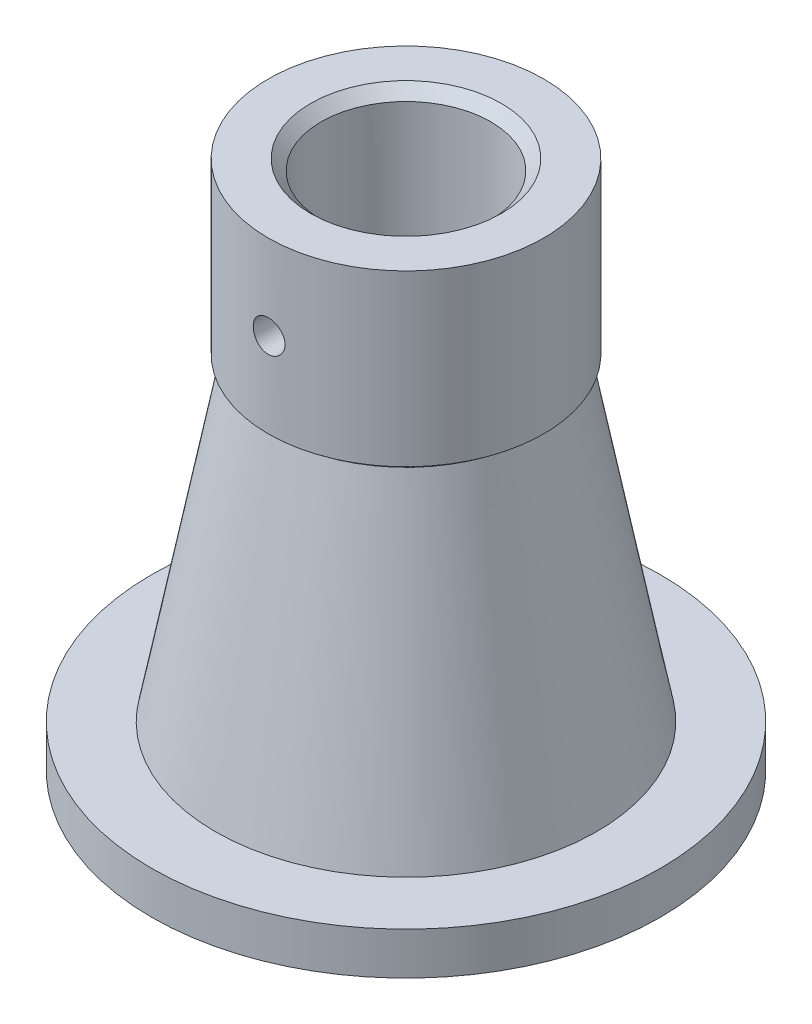
ISO-10303-21;
HEADER;
FILE_DESCRIPTION(('STEP AP214'),'2;1');
FILE_NAME('part.step','',(''),(''),'','','');
FILE_SCHEMA(('AUTOMOTIVE_DESIGN { 1 0 10303 214 1 1 1 1 }'));
ENDSEC;
DATA;
#1=APPLICATION_CONTEXT('core data for automotive mechanical design processes');
#2=APPLICATION_PROTOCOL_DEFINITION('international standard','automotive_design',2000,#1);
#3=PRODUCT_CONTEXT('',#1,'mechanical');
#4=PRODUCT('Part','Part','',(#3));
#5=PRODUCT_RELATED_PRODUCT_CATEGORY('part','',(#4));
#6=PRODUCT_DEFINITION_FORMATION('','',#4);
#7=PRODUCT_DEFINITION_CONTEXT('part definition',#1,'design');
#8=PRODUCT_DEFINITION('design','',#6,#7);
#9=PRODUCT_DEFINITION_SHAPE('','',#8);
#10=(LENGTH_UNIT() NAMED_UNIT(*) SI_UNIT(.MILLI.,.METRE.));
#11=(NAMED_UNIT(*) PLANE_ANGLE_UNIT() SI_UNIT($,.RADIAN.));
#12=(NAMED_UNIT(*) SI_UNIT($,.STERADIAN.) SOLID_ANGLE_UNIT());
#13=UNCERTAINTY_MEASURE_WITH_UNIT(LENGTH_MEASURE(1.E-05),#10,'distance_accuracy_value','');
#14=(GEOMETRIC_REPRESENTATION_CONTEXT(3) GLOBAL_UNCERTAINTY_ASSIGNED_CONTEXT((#13)) GLOBAL_UNIT_ASSIGNED_CONTEXT((#10,
#11,#12)) REPRESENTATION_CONTEXT('',''));
#15=CARTESIAN_POINT('',(0.,0.,0.));
#16=DIRECTION('',(0.,0.,1.));
#17=DIRECTION('',(1.,0.,0.));
#18=AXIS2_PLACEMENT_3D('',#15,#16,#17);
#19=CARTESIAN_POINT('',(0.,126.434782608696,0.));
#20=DIRECTION('',(0.,1.,0.));
#21=DIRECTION('',(0.,0.,1.));
#22=AXIS2_PLACEMENT_3D('',#19,#20,#21);
#23=CYLINDRICAL_SURFACE('',#22,65.);
#24=CARTESIAN_POINT('',(0.,250.,0.));
#25=DIRECTION('',(0.,1.,0.));
#26=DIRECTION('',(0.,0.,1.));
#27=AXIS2_PLACEMENT_3D('',#24,#25,#26);
#28=CIRCLE('',#27,65.);
#29=CARTESIAN_POINT('',(0.,250.,65.));
#30=VERTEX_POINT('',#29);
#31=EDGE_CURVE('E71',#30,#30,#28,.T.);
#32=ORIENTED_EDGE('',*,*,#31,.F.);
#33=EDGE_LOOP('',(#32));
#34=FACE_BOUND('',#33,.T.);
#35=CARTESIAN_POINT('',(0.,170.,0.));
#36=DIRECTION('',(0.,1.,0.));
#37=DIRECTION('',(0.,0.,1.));
#38=AXIS2_PLACEMENT_3D('',#35,#36,#37);
#39=CIRCLE('',#38,65.);
#40=CARTESIAN_POINT('',(0.,170.,65.));
#41=VERTEX_POINT('',#40);
#42=EDGE_CURVE('E68',#41,#41,#39,.T.);
#43=ORIENTED_EDGE('',*,*,#42,.T.);
#44=EDGE_LOOP('',(#43));
#45=FACE_BOUND('',#44,.T.);
#46=CARTESIAN_POINT('',(-7.5,210.,64.5658578507248));
#47=CARTESIAN_POINT('',(-7.50000226594626,210.209959431137,64.5658571285948));
#48=CARTESIAN_POINT('',(-7.49118018237764,210.419885077416,64.5668840736991));
#49=CARTESIAN_POINT('',(-7.45595870806996,210.83830369412,64.57096103377));
#50=CARTESIAN_POINT('',(-7.42955523721588,211.046796320633,64.574011518339));
#51=CARTESIAN_POINT('',(-7.35933288185559,211.460949327729,64.5820521728103));
#52=CARTESIAN_POINT('',(-7.31550064459549,211.666607411389,64.5870438298443));
#53=CARTESIAN_POINT('',(-7.21072565323716,212.073546268437,64.5988251711745));
#54=CARTESIAN_POINT('',(-7.14977663295992,212.274825409635,64.6056155138888));
#55=CARTESIAN_POINT('',(-7.01129140626987,212.671299541507,64.6207910445353));
#56=CARTESIAN_POINT('',(-6.93377222404295,212.866500542809,64.6291745946325));
#57=CARTESIAN_POINT('',(-6.76263842007811,213.249734857629,64.6473056153026));
#58=CARTESIAN_POINT('',(-6.66901787072008,213.437765500166,64.6570535879323));
#59=CARTESIAN_POINT('',(-6.46642735128844,213.805167526787,64.6776288404629));
#60=CARTESIAN_POINT('',(-6.35746596712727,213.984543679701,64.6884555156547));
#61=CARTESIAN_POINT('',(-6.12488191424142,214.333568568564,64.7108914354393));
#62=CARTESIAN_POINT('',(-6.0012538220948,214.503213671572,64.7225009688264));
#63=CARTESIAN_POINT('',(-5.73972518322123,214.832171305297,64.7462188526406));
#64=CARTESIAN_POINT('',(-5.60177077583474,214.991440889943,64.7583289742801));
#65=CARTESIAN_POINT('',(-5.31290677510915,215.297864915849,64.7826676791338));
#66=CARTESIAN_POINT('',(-5.16199241030994,215.445014855627,64.7948963044947));
#67=CARTESIAN_POINT('',(-4.84835771060162,215.726058971959,64.8191187193592));
#68=CARTESIAN_POINT('',(-4.68564116630815,215.859957372249,64.8311125827056));
#69=CARTESIAN_POINT('',(-4.34943291868532,216.113656797444,64.854535953591));
#70=CARTESIAN_POINT('',(-4.17593726237027,216.233452603373,64.8659652512976));
#71=CARTESIAN_POINT('',(-3.81896908737816,216.458335007624,64.887961366149));
#72=CARTESIAN_POINT('',(-3.63547155985923,216.563382143308,64.8985258389936));
#73=CARTESIAN_POINT('',(-3.26021039926499,216.757637724503,64.9184590679162));
#74=CARTESIAN_POINT('',(-3.06844666694015,216.846845979778,64.927827809632));
#75=CARTESIAN_POINT('',(-2.67802285119041,217.008769779811,64.9451027344747));
#76=CARTESIAN_POINT('',(-2.47936305318381,217.081486006216,64.9530089780469));
#77=CARTESIAN_POINT('',(-2.07655304900202,217.20989700838,64.9671342964657));
#78=CARTESIAN_POINT('',(-1.87240274081479,217.265591467642,64.9733533399409));
#79=CARTESIAN_POINT('',(-1.4610399768854,217.359324280402,64.9839017889052));
#80=CARTESIAN_POINT('',(-1.2538461967992,217.397443608012,64.9882398550205));
#81=CARTESIAN_POINT('',(-0.836886645027267,217.456136303733,64.9949468892524));
#82=CARTESIAN_POINT('',(-0.627120008799399,217.476703600448,64.9973151759985));
#83=CARTESIAN_POINT('',(-0.206654095367972,217.500105831763,65.0000110302902));
#84=CARTESIAN_POINT('',(0.00404478658155516,217.502947672689,65.0003393926465));
#85=CARTESIAN_POINT('',(0.424950434743227,217.490916510962,64.9989527716076));
#86=CARTESIAN_POINT('',(0.635156990952223,217.47603697871,64.9972370350458));
#87=CARTESIAN_POINT('',(1.26061069665183,217.405126957799,64.989100728915));
#88=CARTESIAN_POINT('',(1.67317576085794,217.322959965045,64.9797061511094));
#89=CARTESIAN_POINT('',(2.47839221774519,217.091077752687,64.9539864900117));
#90=CARTESIAN_POINT('',(2.87104327984752,216.941361412149,64.9376612917113));
#91=CARTESIAN_POINT('',(3.62662346899018,216.578266070038,64.8998538093771));
#92=CARTESIAN_POINT('',(3.98948179268722,216.364740705887,64.8783596914595));
#93=CARTESIAN_POINT('',(4.67432392854597,215.880195816165,64.8326208403166));
#94=CARTESIAN_POINT('',(4.99630614220927,215.60917404325,64.8083759995921));
#95=CARTESIAN_POINT('',(5.59224356797887,215.015449279366,64.7596857293851));
#96=CARTESIAN_POINT('',(5.86590810673468,214.692454449668,64.7352399541014));
#97=CARTESIAN_POINT('',(6.35518048167907,214.004958597565,64.6890429060712));
#98=CARTESIAN_POINT('',(6.57078818096266,213.640457477287,64.6672916396788));
#99=CARTESIAN_POINT('',(6.93783730294332,212.880051517233,64.6289458835084));
#100=CARTESIAN_POINT('',(7.0892576320424,212.484136404688,64.6123530894122));
#101=CARTESIAN_POINT('',(7.32338689804912,211.672265603129,64.5862369878234));
#102=CARTESIAN_POINT('',(7.40609864210297,211.256310733591,64.5767133915146));
#103=CARTESIAN_POINT('',(7.50008286660713,210.418729166884,64.5658657697814));
#104=CARTESIAN_POINT('',(7.51176345516959,209.99714884517,64.5644949040082));
#105=CARTESIAN_POINT('',(7.4644272626191,209.158036627992,64.5699842715286));
#106=CARTESIAN_POINT('',(7.40541176061295,208.740504659417,64.5768443558994));
#107=CARTESIAN_POINT('',(7.21870603944458,207.922553649004,64.5979797361151));
#108=CARTESIAN_POINT('',(7.09121151493723,207.522089335126,64.61223389772));
#109=CARTESIAN_POINT('',(6.7713502182312,206.748217637103,64.6465351758236));
#110=CARTESIAN_POINT('',(6.57898148868812,206.37481106974,64.6665824671064));
#111=CARTESIAN_POINT('',(6.13388619976384,205.66384484043,64.7103203989203));
#112=CARTESIAN_POINT('',(5.88089108951316,205.326454610301,64.7340270779501));
#113=CARTESIAN_POINT('',(5.32186320379247,204.698662120845,64.7823745719267));
#114=CARTESIAN_POINT('',(5.01582867526214,204.408261415231,64.8070154177285));
#115=CARTESIAN_POINT('',(4.52308261686259,204.013638088661,64.8426494591224));
#116=CARTESIAN_POINT('',(4.3526687846331,203.888620951888,64.8543385600909));
#117=CARTESIAN_POINT('',(4.00188656442386,203.653393457504,64.8769275439821));
#118=CARTESIAN_POINT('',(3.82152187671137,203.543177647619,64.8878277168316));
#119=CARTESIAN_POINT('',(3.45203340939253,203.338308963977,64.9085335325115));
#120=CARTESIAN_POINT('',(3.26290659205533,203.243661540138,64.9183387916689));
#121=CARTESIAN_POINT('',(2.87734634914979,203.070678306647,64.9365698326525));
#122=CARTESIAN_POINT('',(2.68091553095377,202.992336740803,64.944996101056));
#123=CARTESIAN_POINT('',(2.28251334417501,202.852650931519,64.960216935198));
#124=CARTESIAN_POINT('',(2.08055475589749,202.791270610048,64.9670149601798));
#125=CARTESIAN_POINT('',(1.67213794528984,202.685737360397,64.9788095109849));
#126=CARTESIAN_POINT('',(1.46567982673221,202.641584035356,64.9838060783087));
#127=CARTESIAN_POINT('',(1.04974241432843,202.570831613263,64.9918556855716));
#128=CARTESIAN_POINT('',(0.840263160490466,202.544232283967,64.9949087512241));
#129=CARTESIAN_POINT('',(0.419791929398565,202.508786041779,64.9989844175344));
#130=CARTESIAN_POINT('',(0.208799981765138,202.499938782227,65.0000070578422));
#131=CARTESIAN_POINT('',(-0.211988778038598,202.500061509824,64.9999929084272));
#132=CARTESIAN_POINT('',(-0.421785626658581,202.508931400734,64.9989676884602));
#133=CARTESIAN_POINT('',(-0.839805286531488,202.544216476721,64.9949105842206));
#134=CARTESIAN_POINT('',(-1.0480286218615,202.570625533827,64.9918794008087));
#135=CARTESIAN_POINT('',(-1.46153204439344,202.640794234658,64.9838956700565));
#136=CARTESIAN_POINT('',(-1.66681158964572,202.684557031761,64.9789427735218));
#137=CARTESIAN_POINT('',(-2.07293023890297,202.789110634996,64.9672550587187));
#138=CARTESIAN_POINT('',(-2.27376943817195,202.849901075431,64.9605202787193));
#139=CARTESIAN_POINT('',(-2.66954916037621,202.98805100643,64.9454595729931));
#140=CARTESIAN_POINT('',(-2.86449109569862,203.065406493253,64.9371340318026));
#141=CARTESIAN_POINT('',(-3.24716047558091,203.236136839251,64.9191238654313));
#142=CARTESIAN_POINT('',(-3.43488799693181,203.329511527857,64.9094392547217));
#143=CARTESIAN_POINT('',(-3.80185863966134,203.53163395132,64.888979449816));
#144=CARTESIAN_POINT('',(-3.98110018451837,203.640384527861,64.8782040541323));
#145=CARTESIAN_POINT('',(-4.32975687733135,203.87243585051,64.8558687829547));
#146=CARTESIAN_POINT('',(-4.49917554317567,203.995731339011,64.8443091915654));
#147=CARTESIAN_POINT('',(-4.82806491692668,204.256818429186,64.8206536412121));
#148=CARTESIAN_POINT('',(-4.98747036048,204.394692000691,64.8085548975614));
#149=CARTESIAN_POINT('',(-5.29405615316232,204.683302114178,64.7842312155165));
#150=CARTESIAN_POINT('',(-5.44124092526304,204.834033962026,64.7720063245951));
#151=CARTESIAN_POINT('',(-5.72250663632198,205.147446167402,64.7477633648549));
#152=CARTESIAN_POINT('',(-5.85657957691054,205.310133713381,64.7357454259164));
#153=CARTESIAN_POINT('',(-6.11052956720465,205.646177949516,64.7122684589393));
#154=CARTESIAN_POINT('',(-6.23041184069649,205.81953067773,64.7008092261523));
#155=CARTESIAN_POINT('',(-6.45560329565524,206.176406569266,64.678729419573));
#156=CARTESIAN_POINT('',(-6.5608571179017,206.359964873599,64.6681120936065));
#157=CARTESIAN_POINT('',(-6.75547125991437,206.735297728152,64.6480717293649));
#158=CARTESIAN_POINT('',(-6.84483740651906,206.927069234011,64.6386482536086));
#159=CARTESIAN_POINT('',(-7.00700889823298,207.31738092362,64.6212695629369));
#160=CARTESIAN_POINT('',(-7.0798274385089,207.515915568092,64.6133131791145));
#161=CARTESIAN_POINT('',(-7.20844196742309,207.918412807841,64.5990908593219));
#162=CARTESIAN_POINT('',(-7.26424204149813,208.122374087603,64.5928245176837));
#163=CARTESIAN_POINT('',(-7.37393737510261,208.602184370598,64.5804079373932));
#164=CARTESIAN_POINT('',(-7.42116351135466,208.879603292797,64.5749744552904));
#165=CARTESIAN_POINT('',(-7.48419321200805,209.438034989459,64.5676999060517));
#166=CARTESIAN_POINT('',(-7.49999696787749,209.719047742013,64.565858817026));
#167=CARTESIAN_POINT('',(-7.5,210.,64.5658578507248));
#168=B_SPLINE_CURVE_WITH_KNOTS('',3,(#46,#47,#48,#49,#50,#51,#52,#53,#54,#55,#56,#57,#58,#59,
#60,#61,#62,#63,#64,#65,#66,#67,#68,#69,#70,#71,#72,#73,#74,#75,#76,#77,#78,#79,#80,#81,#82,#83,
#84,#85,#86,#87,#88,#89,#90,#91,#92,#93,#94,#95,#96,#97,#98,#99,#100,#101,#102,#103,#104,#105,
#106,#107,#108,#109,#110,#111,#112,#113,#114,#115,#116,#117,#118,#119,#120,#121,#122,#123,#124,
#125,#126,#127,#128,#129,#130,#131,#132,#133,#134,#135,#136,#137,#138,#139,#140,#141,#142,#143,
#144,#145,#146,#147,#148,#149,#150,#151,#152,#153,#154,#155,#156,#157,#158,#159,#160,#161,#162,
#163,#164,#165,#166,#167),.UNSPECIFIED.,.T.,.F.,(4,2,2,2,2,2,2,2,2,2,2,2,2,2,2,2,2,2,2,2,2,2,2,
2,2,2,2,2,2,2,2,2,2,2,2,2,2,2,2,2,2,2,2,2,2,2,2,2,2,2,2,2,2,2,2,2,2,2,2,2,4),(0.,
0.629632474957954,1.25941111976144,1.88967319133563,2.52016629315989,3.15001471331666,
3.78009550662059,4.40982504975717,5.03978818294584,5.6722118870604,6.30486943675431,
6.93732468212007,7.57001325050474,8.2043636782209,8.83872172449032,9.47305354681715,
10.1073971629935,10.7387882137318,11.3703975795253,12.0017608374553,12.6333567988003,
13.8891806730126,15.1450253874844,16.4037731121755,17.6625700462173,18.9286992538077,
20.1948314470567,21.4613794015011,22.7278756075331,23.9870882564922,25.2462781228175,
26.5018885606234,27.7575368853207,29.0188535357457,30.2802118831969,30.9146209282664,
31.5487956352023,32.1831918730578,32.8173637791475,33.4501761771986,34.0829739961311,
34.7157634427466,35.3485405321799,35.9777527447438,36.6067452337587,37.2358520705038,
37.8649453971532,38.4938868443698,39.1228215952086,39.751872734462,40.3806971807908,
41.0132671351129,41.645607139156,42.2783305028812,42.9108202230095,43.545641873577,
44.1802302195007,44.8143107509671,45.4482389456379,46.2907719173177,47.1332997551188),.UNSPECIFIED.);
#169=CARTESIAN_POINT('',(-7.5,210.,64.5658578507248));
#170=VERTEX_POINT('',#169);
#171=EDGE_CURVE('E89',#170,#170,#168,.T.);
#172=ORIENTED_EDGE('',*,*,#171,.T.);
#173=EDGE_LOOP('',(#172));
#174=FACE_BOUND('',#173,.T.);
#175=ADVANCED_FACE('F41',(#34,#45,#174),#23,.T.);
#176=CARTESIAN_POINT('',(0.,126.434782608696,0.));
#177=DIRECTION('',(0.,1.,0.));
#178=DIRECTION('',(0.,0.,1.));
#179=AXIS2_PLACEMENT_3D('',#176,#177,#178);
#180=CYLINDRICAL_SURFACE('',#179,40.);
#181=CARTESIAN_POINT('',(0.,245.,0.));
#182=DIRECTION('',(0.,-1.,0.));
#183=DIRECTION('',(0.,0.,-1.));
#184=AXIS2_PLACEMENT_3D('',#181,#182,#183);
#185=CIRCLE('',#184,40.);
#186=CARTESIAN_POINT('',(0.,245.,-40.));
#187=VERTEX_POINT('',#186);
#188=EDGE_CURVE('E49',#187,#187,#185,.F.);
#189=ORIENTED_EDGE('',*,*,#188,.T.);
#190=EDGE_LOOP('',(#189));
#191=FACE_BOUND('',#190,.T.);
#192=CARTESIAN_POINT('',(0.,170.,0.));
#193=DIRECTION('',(0.,1.,0.));
#194=DIRECTION('',(0.,0.,1.));
#195=AXIS2_PLACEMENT_3D('',#192,#193,#194);
#196=CIRCLE('',#195,40.);
#197=CARTESIAN_POINT('',(0.,170.,40.));
#198=VERTEX_POINT('',#197);
#199=EDGE_CURVE('E74',#198,#198,#196,.T.);
#200=ORIENTED_EDGE('',*,*,#199,.F.);
#201=EDGE_LOOP('',(#200));
#202=FACE_BOUND('',#201,.T.);
#203=CARTESIAN_POINT('',(-7.5,210.,39.2905841137543));
#204=CARTESIAN_POINT('',(-7.50000378139181,209.791286269132,39.2905821782423));
#205=CARTESIAN_POINT('',(-7.4912852637607,209.582621238571,39.2922503106716));
#206=CARTESIAN_POINT('',(-7.45648665908722,209.166733114112,39.2988695092901));
#207=CARTESIAN_POINT('',(-7.43040343613883,208.959510287494,39.3038211684535));
#208=CARTESIAN_POINT('',(-7.36105475876168,208.547947938894,39.3168679945025));
#209=CARTESIAN_POINT('',(-7.31777959110729,208.343610114601,39.3249649383758));
#210=CARTESIAN_POINT('',(-7.2143669784398,207.939305532679,39.344067826025));
#211=CARTESIAN_POINT('',(-7.15422333261502,207.739340411639,39.35507483945));
#212=CARTESIAN_POINT('',(-7.0176295100155,207.345521027009,39.3796607416695));
#213=CARTESIAN_POINT('',(-6.94120088418369,207.151659072119,39.3932362288057));
#214=CARTESIAN_POINT('',(-6.77252626770316,206.771031686962,39.4225850738099));
#215=CARTESIAN_POINT('',(-6.68027444412908,206.584268904798,39.4383592417771));
#216=CARTESIAN_POINT('',(-6.4806852191813,206.21926385429,39.4716473529022));
#217=CARTESIAN_POINT('',(-6.37335482729174,206.041017678187,39.4891604865745));
#218=CARTESIAN_POINT('',(-6.14428714014437,205.694078233941,39.5254498052951));
#219=CARTESIAN_POINT('',(-6.0225444742278,205.525388561821,39.5442264600559));
#220=CARTESIAN_POINT('',(-5.76413060017075,205.19698805143,39.5827240216049));
#221=CARTESIAN_POINT('',(-5.62731249702876,205.037393723868,39.6024529303707));
#222=CARTESIAN_POINT('',(-5.34072941014398,204.730203981023,39.6421182194776));
#223=CARTESIAN_POINT('',(-5.19095964856907,204.58261303305,39.6620546739754));
#224=CARTESIAN_POINT('',(-4.87958110543589,204.300543488419,39.7015655119534));
#225=CARTESIAN_POINT('',(-4.71797589407355,204.166060965867,39.7211400024076));
#226=CARTESIAN_POINT('',(-4.38391872431102,203.911040294238,39.7593954409139));
#227=CARTESIAN_POINT('',(-4.21146279016506,203.790507302793,39.7780760569815));
#228=CARTESIAN_POINT('',(-3.85560513447759,203.563449144384,39.8141497993357));
#229=CARTESIAN_POINT('',(-3.67213138417968,203.457035128207,39.8315322868355));
#230=CARTESIAN_POINT('',(-3.29669257582263,203.260062605552,39.8643615384852));
#231=CARTESIAN_POINT('',(-3.10472746475573,203.169504198071,39.8798082905488));
#232=CARTESIAN_POINT('',(-2.71367566395661,203.00493306356,39.9083248187877));
#233=CARTESIAN_POINT('',(-2.51458950969417,202.930919095485,39.9213947732395));
#234=CARTESIAN_POINT('',(-2.11070662350943,202.800001197674,39.9447847753044));
#235=CARTESIAN_POINT('',(-1.90590983172604,202.743097447368,39.9551047940796));
#236=CARTESIAN_POINT('',(-1.49454411273695,202.647422092814,39.9725932777363));
#237=CARTESIAN_POINT('',(-1.28802464769302,202.608444363427,39.979797509426));
#238=CARTESIAN_POINT('',(-0.872289056726031,202.54793597328,39.9910287005747));
#239=CARTESIAN_POINT('',(-0.663072025003319,202.52641133662,39.9950545629767));
#240=CARTESIAN_POINT('',(-0.243609078902742,202.501016091992,39.9998073309128));
#241=CARTESIAN_POINT('',(-0.0333636550058057,202.49713776015,40.0005356797839));
#242=CARTESIAN_POINT('',(0.386718399783567,202.507024801342,39.9986839447152));
#243=CARTESIAN_POINT('',(0.596554852062274,202.520796658565,39.9961026449024));
#244=CARTESIAN_POINT('',(1.2177418918676,202.587938593236,39.9835750222809));
#245=CARTESIAN_POINT('',(1.6265518285251,202.666796776794,39.9689068258721));
#246=CARTESIAN_POINT('',(2.42480280475052,202.890678317335,39.9284431032317));
#247=CARTESIAN_POINT('',(2.81424313786217,203.035704085649,39.9026471714762));
#248=CARTESIAN_POINT('',(3.56553223355264,203.388638636265,39.8425625321822));
#249=CARTESIAN_POINT('',(3.92721300800367,203.596897434396,39.8082267501191));
#250=CARTESIAN_POINT('',(4.61080473775569,204.070128350553,39.7348575065778));
#251=CARTESIAN_POINT('',(4.9327116433842,204.335106236077,39.695823567543));
#252=CARTESIAN_POINT('',(5.53282676594448,204.919078513253,39.616675648507));
#253=CARTESIAN_POINT('',(5.8102891831137,205.238838918129,39.5765542853419));
#254=CARTESIAN_POINT('',(6.30775894730658,205.920747657774,39.5003254559703));
#255=CARTESIAN_POINT('',(6.52776545360409,206.282896612684,39.4642180485027));
#256=CARTESIAN_POINT('',(6.90429252102835,207.040291349651,39.4000946619147));
#257=CARTESIAN_POINT('',(7.06070467712629,207.435592271866,39.3720925225091));
#258=CARTESIAN_POINT('',(7.3046828538454,208.247505934576,39.3275621212645));
#259=CARTESIAN_POINT('',(7.39225667535265,208.664116254551,39.3110325593569));
#260=CARTESIAN_POINT('',(7.49498370113956,209.500096592843,39.2915760077362));
#261=CARTESIAN_POINT('',(7.51120849177301,209.919330387168,39.2884477631585));
#262=CARTESIAN_POINT('',(7.47364816661808,210.754517466114,39.2956095953729));
#263=CARTESIAN_POINT('',(7.41986651312593,211.170470911946,39.3058990085703));
#264=CARTESIAN_POINT('',(7.24474444239079,211.983763809933,39.3385489073185));
#265=CARTESIAN_POINT('',(7.12396576962123,212.381228640981,39.3608089766912));
#266=CARTESIAN_POINT('',(6.81885737824816,213.150288570988,39.41480706571));
#267=CARTESIAN_POINT('',(6.63452297580309,213.521881760869,39.4465457838772));
#268=CARTESIAN_POINT('',(6.20513215203982,214.233328197982,39.5163775420528));
#269=CARTESIAN_POINT('',(5.95939937098357,214.572765555133,39.5545397017362));
#270=CARTESIAN_POINT('',(5.41486282331753,215.20609733861,39.6327456383905));
#271=CARTESIAN_POINT('',(5.11605428495425,215.499987665597,39.6727895843043));
#272=CARTESIAN_POINT('',(4.63237490666709,215.902209987603,39.731198128913));
#273=CARTESIAN_POINT('',(4.46391676852157,216.030616206605,39.7505220568914));
#274=CARTESIAN_POINT('',(4.11667793128303,216.272773352836,39.7879805355081));
#275=CARTESIAN_POINT('',(3.93790106160693,216.386529666836,39.8061155221091));
#276=CARTESIAN_POINT('',(3.57118519237155,216.598601200879,39.8406899611805));
#277=CARTESIAN_POINT('',(3.38324297113837,216.696910939344,39.8571288110299));
#278=CARTESIAN_POINT('',(2.99963235696015,216.877288947177,39.8878328013561));
#279=CARTESIAN_POINT('',(2.8039669984815,216.959363520722,39.9020987850681));
#280=CARTESIAN_POINT('',(2.40720652617258,217.106327772187,39.92799373314));
#281=CARTESIAN_POINT('',(2.2061425794194,217.171299380649,39.9396352298959));
#282=CARTESIAN_POINT('',(1.79918606759492,217.284057496181,39.9600352477651));
#283=CARTESIAN_POINT('',(1.59329528965753,217.331850259928,39.9687948184013));
#284=CARTESIAN_POINT('',(1.17808873213313,217.409907796843,39.9831872121796));
#285=CARTESIAN_POINT('',(0.968772632992591,217.440170924948,39.9888197418634));
#286=CARTESIAN_POINT('',(0.548271530829174,217.482917797064,39.9967950710835));
#287=CARTESIAN_POINT('',(0.337086551863108,217.4954017696,39.9991379129038));
#288=CARTESIAN_POINT('',(-0.0823511912924124,217.502435419346,40.0004565878703));
#289=CARTESIAN_POINT('',(-0.290599284952848,217.497257051023,39.9994834783281));
#290=CARTESIAN_POINT('',(-0.705904590163133,217.469605680588,39.9943099060772));
#291=CARTESIAN_POINT('',(-0.912961798995311,217.447132639024,39.9901094360064));
#292=CARTESIAN_POINT('',(-1.32440357692152,217.385068686968,39.9785981700427));
#293=CARTESIAN_POINT('',(-1.5287881713331,217.345477938753,39.9712874036356));
#294=CARTESIAN_POINT('',(-1.93343805867145,217.249486587832,39.9537586678697));
#295=CARTESIAN_POINT('',(-2.13370343081329,217.193086308708,39.9435407544733));
#296=CARTESIAN_POINT('',(-2.52837181851814,217.064019095337,39.9205003057972));
#297=CARTESIAN_POINT('',(-2.72278458256085,216.991381128232,39.9076824124639));
#298=CARTESIAN_POINT('',(-3.104785143293,216.830320326014,39.8797817099885));
#299=CARTESIAN_POINT('',(-3.29237300039782,216.741897630673,39.8646989209016));
#300=CARTESIAN_POINT('',(-3.65950453401676,216.549881736635,39.8326749304679));
#301=CARTESIAN_POINT('',(-3.83904634317515,216.446285039871,39.8157333008285));
#302=CARTESIAN_POINT('',(-4.18878483852187,216.224702550783,39.7804596139016));
#303=CARTESIAN_POINT('',(-4.35898473794026,216.106721751544,39.7621280399297));
#304=CARTESIAN_POINT('',(-4.69141249931766,215.855314824704,39.7242878807953));
#305=CARTESIAN_POINT('',(-4.85348658326382,215.721687320153,39.7047659641588));
#306=CARTESIAN_POINT('',(-5.16577910301293,215.441390889401,39.6653437441451));
#307=CARTESIAN_POINT('',(-5.3160017109989,215.29472659168,39.6454435770161));
#308=CARTESIAN_POINT('',(-5.60372463353727,214.989220927412,39.6057997985858));
#309=CARTESIAN_POINT('',(-5.7412172841154,214.830372329265,39.5860562880538));
#310=CARTESIAN_POINT('',(-6.00238689669665,214.501710013382,39.5472979997883));
#311=CARTESIAN_POINT('',(-6.12606892344017,214.331900351664,39.5282829565972));
#312=CARTESIAN_POINT('',(-6.35993648403799,213.980720957272,39.4913327750977));
#313=CARTESIAN_POINT('',(-6.46998022034741,213.799255462777,39.4734098321351));
#314=CARTESIAN_POINT('',(-6.67432185500942,213.427591910444,39.439373181483));
#315=CARTESIAN_POINT('',(-6.76862555208389,213.237397101607,39.4232588082258));
#316=CARTESIAN_POINT('',(-6.94077547166137,212.849664882767,39.3933151058882));
#317=CARTESIAN_POINT('',(-7.01863229827434,212.652132301001,39.3794843057397));
#318=CARTESIAN_POINT('',(-7.15734754089694,212.25109067903,39.3545083252065));
#319=CARTESIAN_POINT('',(-7.21820939148168,212.047582855584,39.3433626022478));
#320=CARTESIAN_POINT('',(-7.34643414881668,211.541374947508,39.3196644715891));
#321=CARTESIAN_POINT('',(-7.40394662261242,211.236042119773,39.3088167295277));
#322=CARTESIAN_POINT('',(-7.480726217955,210.620436921241,39.2942780861766));
#323=CARTESIAN_POINT('',(-7.49999438056042,210.310164685132,39.2905869900741));
#324=CARTESIAN_POINT('',(-7.5,210.,39.2905841137543));
#325=B_SPLINE_CURVE_WITH_KNOTS('',3,(#203,#204,#205,#206,#207,#208,#209,#210,#211,#212,#213,
#214,#215,#216,#217,#218,#219,#220,#221,#222,#223,#224,#225,#226,#227,#228,#229,#230,#231,#232,
#233,#234,#235,#236,#237,#238,#239,#240,#241,#242,#243,#244,#245,#246,#247,#248,#249,#250,#251,
#252,#253,#254,#255,#256,#257,#258,#259,#260,#261,#262,#263,#264,#265,#266,#267,#268,#269,#270,
#271,#272,#273,#274,#275,#276,#277,#278,#279,#280,#281,#282,#283,#284,#285,#286,#287,#288,#289,
#290,#291,#292,#293,#294,#295,#296,#297,#298,#299,#300,#301,#302,#303,#304,#305,#306,#307,#308,
#309,#310,#311,#312,#313,#314,#315,#316,#317,#318,#319,#320,#321,#322,#323,#324),.UNSPECIFIED.,
.T.,.F.,(4,2,2,2,2,2,2,2,2,2,2,2,2,2,2,2,2,2,2,2,2,2,2,2,2,2,2,2,2,2,2,2,2,2,2,2,2,2,2,2,2,2,2,
2,2,2,2,2,2,2,2,2,2,2,2,2,2,2,2,2,4),(0.,0.62586880717436,1.25185067116832,1.87818671092285,
2.50475329273271,3.13049579286754,3.75646945895565,4.38215308939457,5.00807061588569,
5.64074127406577,6.27364632657366,6.90636124171899,7.53930935148544,8.17697703413137,
8.8146486980127,9.45227251229927,10.0899030129159,10.7200060898936,11.3503265604828,
11.9803711102001,12.6106471871328,13.8540467070367,15.0974915435217,16.3479487763114,
17.5985332226897,18.8682949153037,20.1380751867204,21.4100109830293,22.6818026204579,
23.9344266065136,25.1869886441216,26.4292037929541,27.6715105084016,28.9281573098929,
30.1849171469196,30.8223805643474,31.4596089131007,32.0970628888953,32.7342688508838,
33.3683643607034,34.0022286931156,34.6361525007024,35.2700681600581,35.8942674972971,
36.5184682584326,37.1426631022526,37.7668459311927,38.3899240146695,39.0129965811965,
39.6362130115947,40.2592137204643,40.8913634428876,41.5232896215312,42.1555938057875,
42.7876653395963,43.4258379080446,44.0637748485792,44.7012992157315,45.3386946499195,
46.2688092388243,47.1988985084848),.UNSPECIFIED.);
#326=CARTESIAN_POINT('',(-7.5,210.,39.2905841137543));
#327=VERTEX_POINT('',#326);
#328=EDGE_CURVE('E97',#327,#327,#325,.T.);
#329=ORIENTED_EDGE('',*,*,#328,.T.);
#330=EDGE_LOOP('',(#329));
#331=FACE_BOUND('',#330,.T.);
#332=ADVANCED_FACE('F127',(#191,#202,#331),#180,.F.);
#333=CARTESIAN_POINT('',(0.,126.434782608696,0.));
#334=DIRECTION('',(0.,1.,0.));
#335=DIRECTION('',(0.,0.,1.));
#336=AXIS2_PLACEMENT_3D('',#333,#334,#335);
#337=CYLINDRICAL_SURFACE('',#336,120.);
#338=CARTESIAN_POINT('',(0.,20.,0.));
#339=DIRECTION('',(0.,1.,0.));
#340=DIRECTION('',(0.,0.,1.));
#341=AXIS2_PLACEMENT_3D('',#338,#339,#340);
#342=CIRCLE('',#341,120.);
#343=CARTESIAN_POINT('',(0.,20.,120.));
#344=VERTEX_POINT('',#343);
#345=EDGE_CURVE('E53',#344,#344,#342,.T.);
#346=ORIENTED_EDGE('',*,*,#345,.F.);
#347=EDGE_LOOP('',(#346));
#348=FACE_BOUND('',#347,.T.);
#349=CARTESIAN_POINT('',(0.,0.,0.));
#350=DIRECTION('',(0.,1.,0.));
#351=DIRECTION('',(0.,0.,1.));
#352=AXIS2_PLACEMENT_3D('',#349,#350,#351);
#353=CIRCLE('',#352,120.);
#354=CARTESIAN_POINT('',(0.,0.,120.));
#355=VERTEX_POINT('',#354);
#356=EDGE_CURVE('E86',#355,#355,#353,.T.);
#357=ORIENTED_EDGE('',*,*,#356,.T.);
#358=EDGE_LOOP('',(#357));
#359=FACE_BOUND('',#358,.T.);
#360=ADVANCED_FACE('F130',(#348,#359),#337,.T.);
#361=CARTESIAN_POINT('',(120.,20.,0.));
#362=DIRECTION('',(0.,-1.,0.));
#363=DIRECTION('',(0.,0.,-1.));
#364=AXIS2_PLACEMENT_3D('',#361,#362,#363);
#365=PLANE('',#364);
#366=CARTESIAN_POINT('',(0.,20.,0.));
#367=DIRECTION('',(0.,1.,0.));
#368=DIRECTION('',(0.,0.,1.));
#369=AXIS2_PLACEMENT_3D('',#366,#367,#368);
#370=CIRCLE('',#369,90.);
#371=CARTESIAN_POINT('',(0.,20.,90.));
#372=VERTEX_POINT('',#371);
#373=EDGE_CURVE('E57',#372,#372,#370,.T.);
#374=ORIENTED_EDGE('',*,*,#373,.F.);
#375=EDGE_LOOP('',(#374));
#376=FACE_BOUND('',#375,.T.);
#377=ORIENTED_EDGE('',*,*,#345,.T.);
#378=EDGE_LOOP('',(#377));
#379=FACE_BOUND('',#378,.T.);
#380=ADVANCED_FACE('F147',(#376,#379),#365,.F.);
#381=CARTESIAN_POINT('',(0.,20.,0.));
#382=DIRECTION('',(0.,-1.,0.));
#383=DIRECTION('',(0.,0.,-1.));
#384=AXIS2_PLACEMENT_3D('',#381,#382,#383);
#385=CONICAL_SURFACE('',#384,90.,0.188462427370045);
#386=CARTESIAN_POINT('',(0.,167.541531883971,0.));
#387=DIRECTION('',(0.,1.,0.));
#388=DIRECTION('',(0.,0.,1.));
#389=AXIS2_PLACEMENT_3D('',#386,#387,#388);
#390=CIRCLE('',#389,61.8600137167915);
#391=CARTESIAN_POINT('',(0.,167.541531883971,61.8600137167915));
#392=VERTEX_POINT('',#391);
#393=EDGE_CURVE('E62',#392,#392,#390,.T.);
#394=ORIENTED_EDGE('',*,*,#393,.F.);
#395=EDGE_LOOP('',(#394));
#396=FACE_BOUND('',#395,.T.);
#397=ORIENTED_EDGE('',*,*,#373,.T.);
#398=EDGE_LOOP('',(#397));
#399=FACE_BOUND('',#398,.T.);
#400=ADVANCED_FACE('F143',(#396,#399),#385,.T.);
#401=CARTESIAN_POINT('',(0.,165.773023922902,0.));
#402=DIRECTION('',(0.,1.,0.));
#403=DIRECTION('',(0.,0.,1.));
#404=AXIS2_PLACEMENT_3D('',#401,#402,#403);
#405=TOROIDAL_SURFACE('',#404,66.5368053084315,5.);
#406=CARTESIAN_POINT('',(0.,170.,0.));
#407=DIRECTION('',(0.,1.,0.));
#408=DIRECTION('',(0.,0.,1.));
#409=AXIS2_PLACEMENT_3D('',#406,#407,#408);
#410=CIRCLE('',#409,63.8660988019729);
#411=CARTESIAN_POINT('',(0.,170.,63.8660988019729));
#412=VERTEX_POINT('',#411);
#413=EDGE_CURVE('E65',#412,#412,#410,.T.);
#414=ORIENTED_EDGE('',*,*,#413,.F.);
#415=EDGE_LOOP('',(#414));
#416=FACE_BOUND('',#415,.T.);
#417=ORIENTED_EDGE('',*,*,#393,.T.);
#418=EDGE_LOOP('',(#417));
#419=FACE_BOUND('',#418,.T.);
#420=ADVANCED_FACE('F139',(#416,#419),#405,.F.);
#421=CARTESIAN_POINT('',(63.8660988019729,170.,0.));
#422=DIRECTION('',(0.,1.,0.));
#423=DIRECTION('',(0.,0.,1.));
#424=AXIS2_PLACEMENT_3D('',#421,#422,#423);
#425=PLANE('',#424);
#426=ORIENTED_EDGE('',*,*,#42,.F.);
#427=EDGE_LOOP('',(#426));
#428=FACE_BOUND('',#427,.T.);
#429=ORIENTED_EDGE('',*,*,#413,.T.);
#430=EDGE_LOOP('',(#429));
#431=FACE_BOUND('',#430,.T.);
#432=ADVANCED_FACE('F133',(#428,#431),#425,.F.);
#433=CARTESIAN_POINT('',(65.,250.,0.));
#434=DIRECTION('',(0.,-1.,0.));
#435=DIRECTION('',(0.,0.,-1.));
#436=AXIS2_PLACEMENT_3D('',#433,#434,#435);
#437=PLANE('',#436);
#438=CARTESIAN_POINT('',(0.,250.,0.));
#439=DIRECTION('',(0.,-1.,0.));
#440=DIRECTION('',(0.,0.,-1.));
#441=AXIS2_PLACEMENT_3D('',#438,#439,#440);
#442=CIRCLE('',#441,44.9999999999999);
#443=CARTESIAN_POINT('',(0.,250.,-44.9999999999999));
#444=VERTEX_POINT('',#443);
#445=EDGE_CURVE('E10',#444,#444,#442,.T.);
#446=ORIENTED_EDGE('',*,*,#445,.T.);
#447=EDGE_LOOP('',(#446));
#448=FACE_BOUND('',#447,.T.);
#449=ORIENTED_EDGE('',*,*,#31,.T.);
#450=EDGE_LOOP('',(#449));
#451=FACE_BOUND('',#450,.T.);
#452=ADVANCED_FACE('F125',(#448,#451),#437,.F.);
#453=CARTESIAN_POINT('',(40.,170.,0.));
#454=DIRECTION('',(0.,1.,0.));
#455=DIRECTION('',(0.,0.,1.));
#456=AXIS2_PLACEMENT_3D('',#453,#454,#455);
#457=PLANE('',#456);
#458=CARTESIAN_POINT('',(0.,170.,0.));
#459=DIRECTION('',(0.,1.,0.));
#460=DIRECTION('',(0.,0.,1.));
#461=AXIS2_PLACEMENT_3D('',#458,#459,#460);
#462=CIRCLE('',#461,45.);
#463=CARTESIAN_POINT('',(0.,170.,45.));
#464=VERTEX_POINT('',#463);
#465=EDGE_CURVE('E77',#464,#464,#462,.T.);
#466=ORIENTED_EDGE('',*,*,#465,.F.);
#467=EDGE_LOOP('',(#466));
#468=FACE_BOUND('',#467,.T.);
#469=ORIENTED_EDGE('',*,*,#199,.T.);
#470=EDGE_LOOP('',(#469));
#471=FACE_BOUND('',#470,.T.);
#472=ADVANCED_FACE('F121',(#468,#471),#457,.F.);
#473=CARTESIAN_POINT('',(0.,165.23183436932,0.));
#474=DIRECTION('',(0.,1.,0.));
#475=DIRECTION('',(0.,0.,1.));
#476=AXIS2_PLACEMENT_3D('',#473,#474,#475);
#477=TOROIDAL_SURFACE('',#476,43.4951423594243,5.00000000000001);
#478=CARTESIAN_POINT('',(0.,167.115499272997,0.));
#479=DIRECTION('',(0.,1.,0.));
#480=DIRECTION('',(0.,0.,1.));
#481=AXIS2_PLACEMENT_3D('',#478,#479,#480);
#482=CIRCLE('',#481,48.1267518562036);
#483=CARTESIAN_POINT('',(0.,167.115499272997,48.1267518562036));
#484=VERTEX_POINT('',#483);
#485=EDGE_CURVE('E80',#484,#484,#482,.T.);
#486=ORIENTED_EDGE('',*,*,#485,.F.);
#487=EDGE_LOOP('',(#486));
#488=FACE_BOUND('',#487,.T.);
#489=ORIENTED_EDGE('',*,*,#465,.T.);
#490=EDGE_LOOP('',(#489));
#491=FACE_BOUND('',#490,.T.);
#492=ADVANCED_FACE('F117',(#488,#491),#477,.F.);
#493=CARTESIAN_POINT('',(0.,167.115499272997,0.));
#494=DIRECTION('',(0.,-1.,0.));
#495=DIRECTION('',(0.,0.,-1.));
#496=AXIS2_PLACEMENT_3D('',#493,#494,#495);
#497=CONICAL_SURFACE('',#496,48.1267518562036,0.188462427370045);
#498=CARTESIAN_POINT('',(0.,0.,0.));
#499=DIRECTION('',(0.,1.,0.));
#500=DIRECTION('',(0.,0.,1.));
#501=AXIS2_PLACEMENT_3D('',#498,#499,#500);
#502=CIRCLE('',#501,80.);
#503=CARTESIAN_POINT('',(0.,0.,80.));
#504=VERTEX_POINT('',#503);
#505=EDGE_CURVE('E83',#504,#504,#502,.T.);
#506=ORIENTED_EDGE('',*,*,#505,.F.);
#507=EDGE_LOOP('',(#506));
#508=FACE_BOUND('',#507,.T.);
#509=ORIENTED_EDGE('',*,*,#485,.T.);
#510=EDGE_LOOP('',(#509));
#511=FACE_BOUND('',#510,.T.);
#512=ADVANCED_FACE('F113',(#508,#511),#497,.F.);
#513=CARTESIAN_POINT('',(80.,0.,0.));
#514=DIRECTION('',(0.,1.,0.));
#515=DIRECTION('',(0.,0.,1.));
#516=AXIS2_PLACEMENT_3D('',#513,#514,#515);
#517=PLANE('',#516);
#518=ORIENTED_EDGE('',*,*,#356,.F.);
#519=EDGE_LOOP('',(#518));
#520=FACE_BOUND('',#519,.T.);
#521=ORIENTED_EDGE('',*,*,#505,.T.);
#522=EDGE_LOOP('',(#521));
#523=FACE_BOUND('',#522,.T.);
#524=ADVANCED_FACE('F109',(#520,#523),#517,.F.);
#525=CARTESIAN_POINT('',(0.,245.,0.));
#526=DIRECTION('',(0.,1.,0.));
#527=DIRECTION('',(0.,0.,1.));
#528=AXIS2_PLACEMENT_3D('',#525,#526,#527);
#529=CONICAL_SURFACE('',#528,40.,0.785398163397453);
#530=ORIENTED_EDGE('',*,*,#445,.F.);
#531=EDGE_LOOP('',(#530));
#532=FACE_BOUND('',#531,.T.);
#533=ORIENTED_EDGE('',*,*,#188,.F.);
#534=EDGE_LOOP('',(#533));
#535=FACE_BOUND('',#534,.T.);
#536=ADVANCED_FACE('F44',(#532,#535),#529,.F.);
#537=CARTESIAN_POINT('',(0.,210.,120.001));
#538=DIRECTION('',(0.,0.,-1.));
#539=DIRECTION('',(-1.,0.,0.));
#540=AXIS2_PLACEMENT_3D('',#537,#538,#539);
#541=CYLINDRICAL_SURFACE('',#540,7.5);
#542=ORIENTED_EDGE('',*,*,#328,.F.);
#543=EDGE_LOOP('',(#542));
#544=FACE_BOUND('',#543,.T.);
#545=ORIENTED_EDGE('',*,*,#171,.F.);
#546=EDGE_LOOP('',(#545));
#547=FACE_BOUND('',#546,.T.);
#548=ADVANCED_FACE('F102',(#544,#547),#541,.F.);
#549=CLOSED_SHELL('',(#175,#332,#360,#380,#400,#420,#432,#452,#472,#492,#512,#524,#536,#548));
#550=MANIFOLD_SOLID_BREP('B2',#549);
#551=ADVANCED_BREP_SHAPE_REPRESENTATION('',(#18,#550),#14);
#552=SHAPE_DEFINITION_REPRESENTATION(#9,#551);
ENDSEC;
END-ISO-10303-21;
